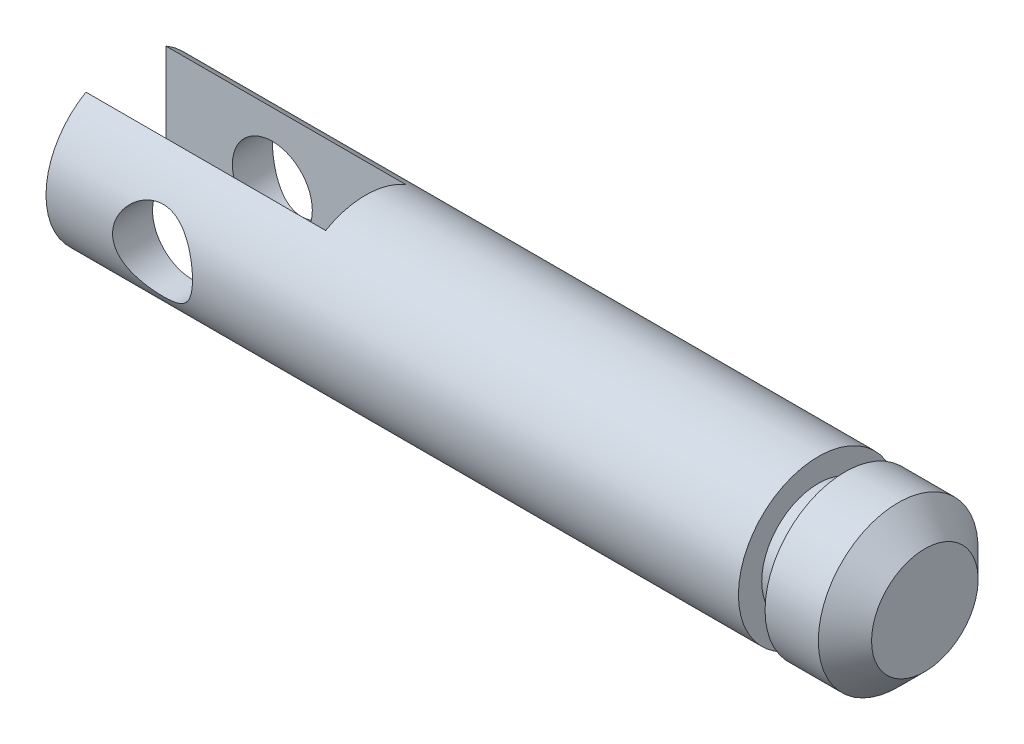
ISO-10303-21;
HEADER;
FILE_DESCRIPTION(('STEP AP214'),'2;1');
FILE_NAME('part.step','',(''),(''),'','','');
FILE_SCHEMA(('AUTOMOTIVE_DESIGN { 1 0 10303 214 1 1 1 1 }'));
ENDSEC;
DATA;
#1=APPLICATION_CONTEXT('core data for automotive mechanical design processes');
#2=APPLICATION_PROTOCOL_DEFINITION('international standard','automotive_design',2000,#1);
#3=PRODUCT_CONTEXT('',#1,'mechanical');
#4=PRODUCT('Part','Part','',(#3));
#5=PRODUCT_RELATED_PRODUCT_CATEGORY('part','',(#4));
#6=PRODUCT_DEFINITION_FORMATION('','',#4);
#7=PRODUCT_DEFINITION_CONTEXT('part definition',#1,'design');
#8=PRODUCT_DEFINITION('design','',#6,#7);
#9=PRODUCT_DEFINITION_SHAPE('','',#8);
#10=(LENGTH_UNIT() NAMED_UNIT(*) SI_UNIT(.MILLI.,.METRE.));
#11=(NAMED_UNIT(*) PLANE_ANGLE_UNIT() SI_UNIT($,.RADIAN.));
#12=(NAMED_UNIT(*) SI_UNIT($,.STERADIAN.) SOLID_ANGLE_UNIT());
#13=UNCERTAINTY_MEASURE_WITH_UNIT(LENGTH_MEASURE(1.E-05),#10,'distance_accuracy_value','');
#14=(GEOMETRIC_REPRESENTATION_CONTEXT(3) GLOBAL_UNCERTAINTY_ASSIGNED_CONTEXT((#13)) GLOBAL_UNIT_ASSIGNED_CONTEXT((#10,
#11,#12)) REPRESENTATION_CONTEXT('',''));
#15=CARTESIAN_POINT('',(0.,0.,0.));
#16=DIRECTION('',(0.,0.,1.));
#17=DIRECTION('',(1.,0.,0.));
#18=AXIS2_PLACEMENT_3D('',#15,#16,#17);
#19=CARTESIAN_POINT('',(0.,3.,0.));
#20=DIRECTION('',(1.,0.,0.));
#21=DIRECTION('',(0.,0.,-1.));
#22=AXIS2_PLACEMENT_3D('',#19,#20,#21);
#23=PLANE('',#22);
#24=CARTESIAN_POINT('',(0.,0.,0.));
#25=DIRECTION('',(-1.,0.,0.));
#26=DIRECTION('',(0.,0.,1.));
#27=AXIS2_PLACEMENT_3D('',#24,#25,#26);
#28=CIRCLE('',#27,3.);
#29=CARTESIAN_POINT('',(0.,2.59807621135331,-1.5));
#30=VERTEX_POINT('',#29);
#31=CARTESIAN_POINT('',(0.,-2.59807621135331,-1.5));
#32=VERTEX_POINT('',#31);
#33=EDGE_CURVE('E104',#30,#32,#28,.T.);
#34=ORIENTED_EDGE('',*,*,#33,.T.);
#35=DIRECTION('',(0.,1.,0.));
#36=VECTOR('',#35,1.);
#37=CARTESIAN_POINT('',(0.,3.,-1.5));
#38=LINE('',#37,#36);
#39=EDGE_CURVE('E125',#32,#30,#38,.T.);
#40=ORIENTED_EDGE('',*,*,#39,.T.);
#41=EDGE_LOOP('',(#34,#40));
#42=FACE_BOUND('',#41,.T.);
#43=ADVANCED_FACE('F37',(#42),#23,.F.);
#44=CARTESIAN_POINT('',(30.,0.,0.));
#45=DIRECTION('',(-1.,0.,0.));
#46=DIRECTION('',(0.,0.,1.));
#47=AXIS2_PLACEMENT_3D('',#44,#45,#46);
#48=PLANE('',#47);
#49=CARTESIAN_POINT('',(30.,0.,0.));
#50=DIRECTION('',(-1.,0.,0.));
#51=DIRECTION('',(0.,0.,1.));
#52=AXIS2_PLACEMENT_3D('',#49,#50,#51);
#53=CIRCLE('',#52,2.);
#54=CARTESIAN_POINT('',(30.,0.,2.));
#55=VERTEX_POINT('',#54);
#56=EDGE_CURVE('E120',#55,#55,#53,.T.);
#57=ORIENTED_EDGE('',*,*,#56,.F.);
#58=EDGE_LOOP('',(#57));
#59=FACE_BOUND('',#58,.T.);
#60=ADVANCED_FACE('F39',(#59),#48,.F.);
#61=CARTESIAN_POINT('',(30.,0.,0.));
#62=DIRECTION('',(-1.,0.,0.));
#63=DIRECTION('',(0.,0.,1.));
#64=AXIS2_PLACEMENT_3D('',#61,#62,#63);
#65=CONICAL_SURFACE('',#64,2.,0.785398163397446);
#66=CARTESIAN_POINT('',(29.,0.,0.));
#67=DIRECTION('',(-1.,0.,0.));
#68=DIRECTION('',(0.,0.,1.));
#69=AXIS2_PLACEMENT_3D('',#66,#67,#68);
#70=CIRCLE('',#69,3.);
#71=CARTESIAN_POINT('',(29.,0.,3.));
#72=VERTEX_POINT('',#71);
#73=EDGE_CURVE('E117',#72,#72,#70,.T.);
#74=ORIENTED_EDGE('',*,*,#73,.F.);
#75=EDGE_LOOP('',(#74));
#76=FACE_BOUND('',#75,.T.);
#77=ORIENTED_EDGE('',*,*,#56,.T.);
#78=EDGE_LOOP('',(#77));
#79=FACE_BOUND('',#78,.T.);
#80=ADVANCED_FACE('F137',(#76,#79),#65,.T.);
#81=CARTESIAN_POINT('',(0.,0.,0.));
#82=DIRECTION('',(-1.,0.,0.));
#83=DIRECTION('',(0.,0.,1.));
#84=AXIS2_PLACEMENT_3D('',#81,#82,#83);
#85=CYLINDRICAL_SURFACE('',#84,3.);
#86=CARTESIAN_POINT('',(27.,0.,0.));
#87=DIRECTION('',(-1.,0.,0.));
#88=DIRECTION('',(0.,0.,1.));
#89=AXIS2_PLACEMENT_3D('',#86,#87,#88);
#90=CIRCLE('',#89,3.);
#91=CARTESIAN_POINT('',(27.,0.,3.));
#92=VERTEX_POINT('',#91);
#93=EDGE_CURVE('E114',#92,#92,#90,.T.);
#94=ORIENTED_EDGE('',*,*,#93,.F.);
#95=EDGE_LOOP('',(#94));
#96=FACE_BOUND('',#95,.T.);
#97=ORIENTED_EDGE('',*,*,#73,.T.);
#98=EDGE_LOOP('',(#97));
#99=FACE_BOUND('',#98,.T.);
#100=ADVANCED_FACE('F274',(#96,#99),#85,.T.);
#101=CARTESIAN_POINT('',(27.,3.,0.));
#102=DIRECTION('',(1.,0.,0.));
#103=DIRECTION('',(0.,0.,-1.));
#104=AXIS2_PLACEMENT_3D('',#101,#102,#103);
#105=PLANE('',#104);
#106=CARTESIAN_POINT('',(27.,0.,0.));
#107=DIRECTION('',(-1.,0.,0.));
#108=DIRECTION('',(0.,0.,1.));
#109=AXIS2_PLACEMENT_3D('',#106,#107,#108);
#110=CIRCLE('',#109,2.125);
#111=CARTESIAN_POINT('',(27.,0.,2.125));
#112=VERTEX_POINT('',#111);
#113=EDGE_CURVE('E111',#112,#112,#110,.T.);
#114=ORIENTED_EDGE('',*,*,#113,.F.);
#115=EDGE_LOOP('',(#114));
#116=FACE_BOUND('',#115,.T.);
#117=ORIENTED_EDGE('',*,*,#93,.T.);
#118=EDGE_LOOP('',(#117));
#119=FACE_BOUND('',#118,.T.);
#120=ADVANCED_FACE('F264',(#116,#119),#105,.F.);
#121=CARTESIAN_POINT('',(0.,0.,0.));
#122=DIRECTION('',(-1.,0.,0.));
#123=DIRECTION('',(0.,0.,1.));
#124=AXIS2_PLACEMENT_3D('',#121,#122,#123);
#125=CYLINDRICAL_SURFACE('',#124,2.125);
#126=CARTESIAN_POINT('',(26.,0.,0.));
#127=DIRECTION('',(-1.,0.,0.));
#128=DIRECTION('',(0.,0.,1.));
#129=AXIS2_PLACEMENT_3D('',#126,#127,#128);
#130=CIRCLE('',#129,2.125);
#131=CARTESIAN_POINT('',(26.,0.,2.125));
#132=VERTEX_POINT('',#131);
#133=EDGE_CURVE('E108',#132,#132,#130,.T.);
#134=ORIENTED_EDGE('',*,*,#133,.F.);
#135=EDGE_LOOP('',(#134));
#136=FACE_BOUND('',#135,.T.);
#137=ORIENTED_EDGE('',*,*,#113,.T.);
#138=EDGE_LOOP('',(#137));
#139=FACE_BOUND('',#138,.T.);
#140=ADVANCED_FACE('F153',(#136,#139),#125,.T.);
#141=CARTESIAN_POINT('',(26.,2.125,0.));
#142=DIRECTION('',(-1.,0.,0.));
#143=DIRECTION('',(0.,0.,1.));
#144=AXIS2_PLACEMENT_3D('',#141,#142,#143);
#145=PLANE('',#144);
#146=CARTESIAN_POINT('',(26.,0.,0.));
#147=DIRECTION('',(-1.,0.,0.));
#148=DIRECTION('',(0.,0.,1.));
#149=AXIS2_PLACEMENT_3D('',#146,#147,#148);
#150=CIRCLE('',#149,3.);
#151=CARTESIAN_POINT('',(26.,0.,3.));
#152=VERTEX_POINT('',#151);
#153=EDGE_CURVE('E105',#152,#152,#150,.T.);
#154=ORIENTED_EDGE('',*,*,#153,.F.);
#155=EDGE_LOOP('',(#154));
#156=FACE_BOUND('',#155,.T.);
#157=ORIENTED_EDGE('',*,*,#133,.T.);
#158=EDGE_LOOP('',(#157));
#159=FACE_BOUND('',#158,.T.);
#160=ADVANCED_FACE('F148',(#156,#159),#145,.F.);
#161=CARTESIAN_POINT('',(0.,0.,0.));
#162=DIRECTION('',(-1.,0.,0.));
#163=DIRECTION('',(0.,0.,1.));
#164=AXIS2_PLACEMENT_3D('',#161,#162,#163);
#165=CYLINDRICAL_SURFACE('',#164,3.);
#166=CARTESIAN_POINT('',(5.5,0.,-3.));
#167=CARTESIAN_POINT('',(5.49999504652421,0.0788579444268501,-2.99999570107562));
#168=CARTESIAN_POINT('',(5.49374489031842,0.157809899546344,-2.99685736529634));
#169=CARTESIAN_POINT('',(5.46902067948769,0.313380352903344,-2.98461234055735));
#170=CARTESIAN_POINT('',(5.45052341050328,0.389994130070444,-2.97549431743379));
#171=CARTESIAN_POINT('',(5.40220928707506,0.538400317320673,-2.95224419105063));
#172=CARTESIAN_POINT('',(5.37243642362805,0.610210204408719,-2.93813158766306));
#173=CARTESIAN_POINT('',(5.30264406795252,0.747708925209897,-2.90618664773642));
#174=CARTESIAN_POINT('',(5.2626253836267,0.813398240985088,-2.88835460450288));
#175=CARTESIAN_POINT('',(5.17072412577207,0.941261726642863,-2.84934387387093));
#176=CARTESIAN_POINT('',(5.11827028114054,1.00298281668316,-2.82802798691306));
#177=CARTESIAN_POINT('',(5.00421778112945,1.11716916730047,-2.78489955370114));
#178=CARTESIAN_POINT('',(4.94261222234134,1.16962737466015,-2.76308664313552));
#179=CARTESIAN_POINT('',(4.80627497571493,1.26787800067542,-2.71948426796021));
#180=CARTESIAN_POINT('',(4.73089585248113,1.31283800332745,-2.69782780455198));
#181=CARTESIAN_POINT('',(4.57244899602068,1.38925234033604,-2.65928968158481));
#182=CARTESIAN_POINT('',(4.48938680691588,1.4207163224495,-2.64240461410484));
#183=CARTESIAN_POINT('',(4.32300234186712,1.46719866328288,-2.61686800556713));
#184=CARTESIAN_POINT('',(4.23999332189891,1.48308878562066,-2.6077840737557));
#185=CARTESIAN_POINT('',(4.07203174333078,1.50064048996327,-2.59772834922792));
#186=CARTESIAN_POINT('',(3.98708118869327,1.50231613255961,-2.59674854014932));
#187=CARTESIAN_POINT('',(3.82857096352695,1.49203093075844,-2.60266395385873));
#188=CARTESIAN_POINT('',(3.75486395316542,1.48167683930523,-2.6086314549302));
#189=CARTESIAN_POINT('',(3.61041713594044,1.4504097735854,-2.62614343100775));
#190=CARTESIAN_POINT('',(3.53967828204203,1.42949343584648,-2.63768968247664));
#191=CARTESIAN_POINT('',(3.40115630115151,1.377314670579,-2.66531214619111));
#192=CARTESIAN_POINT('',(3.33348040182132,1.34582260067399,-2.68148760995998));
#193=CARTESIAN_POINT('',(3.20404856111499,1.273562531502,-2.71655106422105));
#194=CARTESIAN_POINT('',(3.14229529659987,1.2327903657187,-2.73544027170286));
#195=CARTESIAN_POINT('',(3.01821812088516,1.13709908236918,-2.77669736854929));
#196=CARTESIAN_POINT('',(2.95681468963576,1.08104168755392,-2.79920265355119));
#197=CARTESIAN_POINT('',(2.84389687211365,0.959333368112059,-2.84321434950611));
#198=CARTESIAN_POINT('',(2.79238721194918,0.893677884861427,-2.86472027938201));
#199=CARTESIAN_POINT('',(2.69847150845541,0.750774758747772,-2.90552980924446));
#200=CARTESIAN_POINT('',(2.65659929133139,0.673130387399113,-2.92468476243011));
#201=CARTESIAN_POINT('',(2.58685445643549,0.510699323233195,-2.95736821681863));
#202=CARTESIAN_POINT('',(2.55897072247725,0.425918364397913,-2.9709011841533));
#203=CARTESIAN_POINT('',(2.52028689442499,0.259149737491053,-2.98986500612153));
#204=CARTESIAN_POINT('',(2.50826314637983,0.177512295822489,-2.99587407451965));
#205=CARTESIAN_POINT('',(2.49780290329827,0.0131693999240275,-3.00109520188655));
#206=CARTESIAN_POINT('',(2.4993599715408,-0.0695355298048631,-3.00031048081978));
#207=CARTESIAN_POINT('',(2.51531003262812,-0.22684945797898,-2.99236788380152));
#208=CARTESIAN_POINT('',(2.52869879909499,-0.301589112074895,-2.98570868532252));
#209=CARTESIAN_POINT('',(2.56635710784268,-0.447610338452911,-2.9673325697226));
#210=CARTESIAN_POINT('',(2.59062784968024,-0.51889152853663,-2.95561509501618));
#211=CARTESIAN_POINT('',(2.64999769964955,-0.658332912674359,-2.92776377120382));
#212=CARTESIAN_POINT('',(2.68538657517443,-0.726345595508705,-2.91151322654446));
#213=CARTESIAN_POINT('',(2.76566130346985,-0.855692042548907,-2.87615961476126));
#214=CARTESIAN_POINT('',(2.81055120189309,-0.917022944664887,-2.85705533350407));
#215=CARTESIAN_POINT('',(2.91364063799608,-1.03765153393382,-2.81562332004297));
#216=CARTESIAN_POINT('',(2.97271430266772,-1.09615811672854,-2.79316327265249));
#217=CARTESIAN_POINT('',(3.09988772691659,-1.20278448167828,-2.7489358741323));
#218=CARTESIAN_POINT('',(3.16799367827188,-1.25089707856781,-2.7271690110007));
#219=CARTESIAN_POINT('',(3.31546548125946,-1.33756187171853,-2.68576788309734));
#220=CARTESIAN_POINT('',(3.39521689914172,-1.37553824370037,-2.66628794383591));
#221=CARTESIAN_POINT('',(3.56126510136245,-1.43712423890206,-2.63361108441202));
#222=CARTESIAN_POINT('',(3.64755328970034,-1.46075237380052,-2.62040607332625));
#223=CARTESIAN_POINT('',(3.81536533432706,-1.49079253120031,-2.60342251538703));
#224=CARTESIAN_POINT('',(3.89655138015286,-1.49863949460818,-2.59886075197597));
#225=CARTESIAN_POINT('',(4.05917060074679,-1.5010337315643,-2.59748031962405));
#226=CARTESIAN_POINT('',(4.14060365310679,-1.49558676993486,-2.60065829439585));
#227=CARTESIAN_POINT('',(4.29322525230016,-1.47288918838996,-2.61356793076615));
#228=CARTESIAN_POINT('',(4.36465070521711,-1.45681247151455,-2.62264641723988));
#229=CARTESIAN_POINT('',(4.50371217913655,-1.41476303733662,-2.64556524281479));
#230=CARTESIAN_POINT('',(4.57134697313805,-1.38878713673988,-2.65940711354503));
#231=CARTESIAN_POINT('',(4.70593727647981,-1.32572361795085,-2.69142795546803));
#232=CARTESIAN_POINT('',(4.77254185274354,-1.28800670672355,-2.70983583593881));
#233=CARTESIAN_POINT('',(4.89891180427189,-1.20322645745609,-2.7485299745229));
#234=CARTESIAN_POINT('',(4.95867359578167,-1.15615825686234,-2.76881720693416));
#235=CARTESIAN_POINT('',(5.07721297353201,-1.04730498999206,-2.81193484737138));
#236=CARTESIAN_POINT('',(5.13498865352544,-0.984426634495891,-2.83477474959942));
#237=CARTESIAN_POINT('',(5.2393944751529,-0.849232209349795,-2.87816628389896));
#238=CARTESIAN_POINT('',(5.28601860920486,-0.776911084957796,-2.89871667939293));
#239=CARTESIAN_POINT('',(5.3668545440681,-0.623897395174419,-2.93547014349806));
#240=CARTESIAN_POINT('',(5.4009762538547,-0.543149255665096,-2.95164144740899));
#241=CARTESIAN_POINT('',(5.45471225163611,-0.37611315170713,-2.9775201194848));
#242=CARTESIAN_POINT('',(5.47436777020857,-0.28984169938365,-2.98724585044602));
#243=CARTESIAN_POINT('',(5.49084611662861,-0.168902919736343,-2.99543192870217));
#244=CARTESIAN_POINT('',(5.49427396129951,-0.135242819162347,-2.99714048010376));
#245=CARTESIAN_POINT('',(5.49885199827113,-0.0677275977076368,-2.99942545465223));
#246=CARTESIAN_POINT('',(5.50000212770531,-0.0338724714699424,-3.00000184655071));
#247=CARTESIAN_POINT('',(5.5,0.,-3.));
#248=B_SPLINE_CURVE_WITH_KNOTS('',3,(#166,#167,#168,#169,#170,#171,#172,#173,#174,#175,#176,
#177,#178,#179,#180,#181,#182,#183,#184,#185,#186,#187,#188,#189,#190,#191,#192,#193,#194,#195,
#196,#197,#198,#199,#200,#201,#202,#203,#204,#205,#206,#207,#208,#209,#210,#211,#212,#213,#214,
#215,#216,#217,#218,#219,#220,#221,#222,#223,#224,#225,#226,#227,#228,#229,#230,#231,#232,#233,
#234,#235,#236,#237,#238,#239,#240,#241,#242,#243,#244,#245,#246,#247),.UNSPECIFIED.,.T.,.F.,(4,
2,2,2,2,2,2,2,2,2,2,2,2,2,2,2,2,2,2,2,2,2,2,2,2,2,2,2,2,2,2,2,2,2,2,2,2,2,2,2,4),(0.,
0.236436386130439,0.473322224563796,0.709293233238447,0.945245640872351,1.19547263807713,
1.44588935648105,1.71572589646129,1.98536921847421,2.23887018210344,2.49212035993531,
2.71508568613981,2.93812205888518,3.16635360252731,3.39468781890333,3.65197412000818,
3.90938301898029,4.17874533321661,4.44789325368419,4.69474935707018,4.94148846767214,
5.16910359759183,5.39674382446397,5.63089284041848,5.86514176122509,6.12239415966628,
6.37982382923147,6.64972023242588,6.91926767918176,7.1629396125457,7.40650589797017,
7.62686895373283,7.84730293182526,8.08254685170431,8.31791341715446,8.58187864135757,
8.84598575071868,9.1119602049529,9.37717362931724,9.47872920200875,9.58028757766599),.UNSPECIFIED.);
#249=CARTESIAN_POINT('',(5.5,0.,-3.));
#250=VERTEX_POINT('',#249);
#251=EDGE_CURVE('E86',#250,#250,#248,.T.);
#252=ORIENTED_EDGE('',*,*,#251,.T.);
#253=EDGE_LOOP('',(#252));
#254=FACE_BOUND('',#253,.T.);
#255=CARTESIAN_POINT('',(5.5,0.,3.));
#256=CARTESIAN_POINT('',(5.49999504652421,-0.0788579444268501,2.99999570107562));
#257=CARTESIAN_POINT('',(5.49374489031842,-0.157809899546344,2.99685736529635));
#258=CARTESIAN_POINT('',(5.46902067948769,-0.313380352903344,2.98461234055735));
#259=CARTESIAN_POINT('',(5.45052341050328,-0.389994130070444,2.97549431743379));
#260=CARTESIAN_POINT('',(5.40220928707506,-0.538400317320673,2.95224419105063));
#261=CARTESIAN_POINT('',(5.37243642362805,-0.610210204408719,2.93813158766306));
#262=CARTESIAN_POINT('',(5.30264406795252,-0.747708925209898,2.90618664773642));
#263=CARTESIAN_POINT('',(5.2626253836267,-0.813398240985088,2.88835460450288));
#264=CARTESIAN_POINT('',(5.17072412577207,-0.941261726642864,2.84934387387093));
#265=CARTESIAN_POINT('',(5.11827028114054,-1.00298281668316,2.82802798691306));
#266=CARTESIAN_POINT('',(5.00421778112945,-1.11716916730047,2.78489955370114));
#267=CARTESIAN_POINT('',(4.94261222234134,-1.16962737466015,2.76308664313552));
#268=CARTESIAN_POINT('',(4.80627497571493,-1.26787800067542,2.71948426796021));
#269=CARTESIAN_POINT('',(4.73089585248113,-1.31283800332745,2.69782780455198));
#270=CARTESIAN_POINT('',(4.57244899602068,-1.38925234033604,2.65928968158481));
#271=CARTESIAN_POINT('',(4.48938680691588,-1.4207163224495,2.64240461410484));
#272=CARTESIAN_POINT('',(4.32300234186712,-1.46719866328288,2.61686800556713));
#273=CARTESIAN_POINT('',(4.23999332189891,-1.48308878562066,2.6077840737557));
#274=CARTESIAN_POINT('',(4.07203174333078,-1.50064048996327,2.59772834922791));
#275=CARTESIAN_POINT('',(3.98708118869327,-1.50231613255961,2.59674854014932));
#276=CARTESIAN_POINT('',(3.82857096352695,-1.49203093075844,2.60266395385873));
#277=CARTESIAN_POINT('',(3.75486395316542,-1.48167683930523,2.6086314549302));
#278=CARTESIAN_POINT('',(3.61041713594044,-1.4504097735854,2.62614343100775));
#279=CARTESIAN_POINT('',(3.53967828204203,-1.42949343584648,2.63768968247664));
#280=CARTESIAN_POINT('',(3.40115630115151,-1.37731467057901,2.66531214619111));
#281=CARTESIAN_POINT('',(3.33348040182132,-1.34582260067399,2.68148760995998));
#282=CARTESIAN_POINT('',(3.20404856111499,-1.273562531502,2.71655106422105));
#283=CARTESIAN_POINT('',(3.14229529659987,-1.2327903657187,2.73544027170286));
#284=CARTESIAN_POINT('',(3.01821812088516,-1.13709908236918,2.77669736854929));
#285=CARTESIAN_POINT('',(2.95681468963576,-1.08104168755392,2.79920265355119));
#286=CARTESIAN_POINT('',(2.84389687211365,-0.95933336811206,2.84321434950611));
#287=CARTESIAN_POINT('',(2.79238721194918,-0.893677884861428,2.86472027938201));
#288=CARTESIAN_POINT('',(2.69847150845541,-0.750774758747773,2.90552980924446));
#289=CARTESIAN_POINT('',(2.65659929133139,-0.673130387399114,2.92468476243011));
#290=CARTESIAN_POINT('',(2.58685445643549,-0.510699323233195,2.95736821681863));
#291=CARTESIAN_POINT('',(2.55897072247725,-0.425918364397914,2.9709011841533));
#292=CARTESIAN_POINT('',(2.52028689442499,-0.259149737491054,2.98986500612153));
#293=CARTESIAN_POINT('',(2.50826314637983,-0.17751229582249,2.99587407451965));
#294=CARTESIAN_POINT('',(2.49780290329827,-0.0131693999240277,3.00109520188655));
#295=CARTESIAN_POINT('',(2.4993599715408,0.0695355298048628,3.00031048081978));
#296=CARTESIAN_POINT('',(2.51531003262812,0.22684945797898,2.99236788380152));
#297=CARTESIAN_POINT('',(2.52869879909499,0.301589112074894,2.98570868532252));
#298=CARTESIAN_POINT('',(2.56635710784268,0.447610338452911,2.9673325697226));
#299=CARTESIAN_POINT('',(2.59062784968024,0.51889152853663,2.95561509501618));
#300=CARTESIAN_POINT('',(2.64999769964955,0.658332912674359,2.92776377120382));
#301=CARTESIAN_POINT('',(2.68538657517443,0.726345595508705,2.91151322654446));
#302=CARTESIAN_POINT('',(2.76566130346985,0.855692042548907,2.87615961476126));
#303=CARTESIAN_POINT('',(2.81055120189309,0.917022944664887,2.85705533350407));
#304=CARTESIAN_POINT('',(2.91364063799608,1.03765153393382,2.81562332004297));
#305=CARTESIAN_POINT('',(2.97271430266772,1.09615811672854,2.79316327265249));
#306=CARTESIAN_POINT('',(3.09988772691659,1.20278448167828,2.7489358741323));
#307=CARTESIAN_POINT('',(3.16799367827188,1.25089707856781,2.7271690110007));
#308=CARTESIAN_POINT('',(3.31546548125946,1.33756187171853,2.68576788309734));
#309=CARTESIAN_POINT('',(3.39521689914172,1.37553824370037,2.66628794383591));
#310=CARTESIAN_POINT('',(3.56126510136245,1.43712423890206,2.63361108441202));
#311=CARTESIAN_POINT('',(3.64755328970034,1.46075237380052,2.62040607332625));
#312=CARTESIAN_POINT('',(3.81536533432706,1.49079253120031,2.60342251538703));
#313=CARTESIAN_POINT('',(3.89655138015286,1.49863949460818,2.59886075197597));
#314=CARTESIAN_POINT('',(4.05917060074679,1.5010337315643,2.59748031962405));
#315=CARTESIAN_POINT('',(4.14060365310679,1.49558676993486,2.60065829439585));
#316=CARTESIAN_POINT('',(4.29322525230016,1.47288918838996,2.61356793076615));
#317=CARTESIAN_POINT('',(4.36465070521711,1.45681247151455,2.62264641723988));
#318=CARTESIAN_POINT('',(4.50371217913655,1.41476303733662,2.64556524281479));
#319=CARTESIAN_POINT('',(4.57134697313805,1.38878713673988,2.65940711354503));
#320=CARTESIAN_POINT('',(4.70593727647981,1.32572361795085,2.69142795546803));
#321=CARTESIAN_POINT('',(4.77254185274354,1.28800670672355,2.70983583593881));
#322=CARTESIAN_POINT('',(4.89891180427189,1.20322645745609,2.7485299745229));
#323=CARTESIAN_POINT('',(4.95867359578167,1.15615825686234,2.76881720693416));
#324=CARTESIAN_POINT('',(5.07721297353201,1.04730498999206,2.81193484737138));
#325=CARTESIAN_POINT('',(5.13498865352544,0.984426634495891,2.83477474959942));
#326=CARTESIAN_POINT('',(5.2393944751529,0.849232209349795,2.87816628389896));
#327=CARTESIAN_POINT('',(5.28601860920486,0.776911084957796,2.89871667939293));
#328=CARTESIAN_POINT('',(5.3668545440681,0.623897395174419,2.93547014349806));
#329=CARTESIAN_POINT('',(5.4009762538547,0.543149255665096,2.95164144740899));
#330=CARTESIAN_POINT('',(5.45471225163611,0.37611315170713,2.9775201194848));
#331=CARTESIAN_POINT('',(5.47436777020857,0.28984169938365,2.98724585044602));
#332=CARTESIAN_POINT('',(5.49084611662861,0.168902919736343,2.99543192870217));
#333=CARTESIAN_POINT('',(5.49427396129951,0.135242819162348,2.99714048010376));
#334=CARTESIAN_POINT('',(5.49885199827113,0.067727597707638,2.99942545465223));
#335=CARTESIAN_POINT('',(5.50000212770531,0.033872471469943,3.00000184655071));
#336=CARTESIAN_POINT('',(5.5,0.,3.));
#337=B_SPLINE_CURVE_WITH_KNOTS('',3,(#255,#256,#257,#258,#259,#260,#261,#262,#263,#264,#265,
#266,#267,#268,#269,#270,#271,#272,#273,#274,#275,#276,#277,#278,#279,#280,#281,#282,#283,#284,
#285,#286,#287,#288,#289,#290,#291,#292,#293,#294,#295,#296,#297,#298,#299,#300,#301,#302,#303,
#304,#305,#306,#307,#308,#309,#310,#311,#312,#313,#314,#315,#316,#317,#318,#319,#320,#321,#322,
#323,#324,#325,#326,#327,#328,#329,#330,#331,#332,#333,#334,#335,#336),.UNSPECIFIED.,.T.,.F.,(4,
2,2,2,2,2,2,2,2,2,2,2,2,2,2,2,2,2,2,2,2,2,2,2,2,2,2,2,2,2,2,2,2,2,2,2,2,2,2,2,4),(0.,
0.236436386130439,0.473322224563796,0.709293233238448,0.945245640872351,1.19547263807713,
1.44588935648105,1.71572589646129,1.98536921847421,2.23887018210344,2.49212035993531,
2.71508568613981,2.93812205888518,3.16635360252731,3.39468781890332,3.65197412000818,
3.90938301898029,4.17874533321661,4.44789325368419,4.69474935707018,4.94148846767214,
5.16910359759183,5.39674382446397,5.63089284041848,5.86514176122509,6.12239415966628,
6.37982382923147,6.64972023242588,6.91926767918176,7.1629396125457,7.40650589797017,
7.62686895373283,7.84730293182526,8.0825468517043,8.31791341715446,8.58187864135757,
8.84598575071868,9.1119602049529,9.37717362931724,9.47872920200875,9.58028757766599),.UNSPECIFIED.);
#338=CARTESIAN_POINT('',(5.5,0.,3.));
#339=VERTEX_POINT('',#338);
#340=EDGE_CURVE('E162',#339,#339,#337,.T.);
#341=ORIENTED_EDGE('',*,*,#340,.T.);
#342=EDGE_LOOP('',(#341));
#343=FACE_BOUND('',#342,.T.);
#344=ORIENTED_EDGE('',*,*,#33,.F.);
#345=DIRECTION('',(-1.,0.,0.));
#346=VECTOR('',#345,1.);
#347=CARTESIAN_POINT('',(0.,2.59807621135332,-1.5));
#348=LINE('',#347,#346);
#349=CARTESIAN_POINT('',(9.,2.59807621135332,-1.5));
#350=VERTEX_POINT('',#349);
#351=EDGE_CURVE('E95',#30,#350,#348,.F.);
#352=ORIENTED_EDGE('',*,*,#351,.T.);
#353=CARTESIAN_POINT('',(9.,0.,0.));
#354=DIRECTION('',(1.,0.,0.));
#355=DIRECTION('',(0.,0.,-1.));
#356=AXIS2_PLACEMENT_3D('',#353,#354,#355);
#357=CIRCLE('',#356,3.);
#358=CARTESIAN_POINT('',(9.,2.59807621135332,1.5));
#359=VERTEX_POINT('',#358);
#360=EDGE_CURVE('E46',#350,#359,#357,.T.);
#361=ORIENTED_EDGE('',*,*,#360,.T.);
#362=DIRECTION('',(-1.,0.,0.));
#363=VECTOR('',#362,1.);
#364=CARTESIAN_POINT('',(0.,2.59807621135332,1.5));
#365=LINE('',#364,#363);
#366=CARTESIAN_POINT('',(0.,2.59807621135331,1.5));
#367=VERTEX_POINT('',#366);
#368=EDGE_CURVE('E85',#359,#367,#365,.T.);
#369=ORIENTED_EDGE('',*,*,#368,.T.);
#370=CARTESIAN_POINT('',(0.,-2.59807621135331,1.5));
#371=VERTEX_POINT('',#370);
#372=EDGE_CURVE('E93',#371,#367,#28,.T.);
#373=ORIENTED_EDGE('',*,*,#372,.F.);
#374=DIRECTION('',(-1.,0.,0.));
#375=VECTOR('',#374,1.);
#376=CARTESIAN_POINT('',(0.,-2.59807621135332,1.5));
#377=LINE('',#376,#375);
#378=CARTESIAN_POINT('',(9.,-2.59807621135332,1.5));
#379=VERTEX_POINT('',#378);
#380=EDGE_CURVE('E53',#371,#379,#377,.F.);
#381=ORIENTED_EDGE('',*,*,#380,.T.);
#382=CARTESIAN_POINT('',(9.,-2.59807621135332,-1.5));
#383=VERTEX_POINT('',#382);
#384=EDGE_CURVE('E11',#379,#383,#357,.T.);
#385=ORIENTED_EDGE('',*,*,#384,.T.);
#386=DIRECTION('',(-1.,0.,0.));
#387=VECTOR('',#386,1.);
#388=CARTESIAN_POINT('',(0.,-2.59807621135332,-1.5));
#389=LINE('',#388,#387);
#390=EDGE_CURVE('E101',#383,#32,#389,.T.);
#391=ORIENTED_EDGE('',*,*,#390,.T.);
#392=EDGE_LOOP('',(#344,#352,#361,#369,#373,#381,#385,#391));
#393=FACE_BOUND('',#392,.T.);
#394=ORIENTED_EDGE('',*,*,#153,.T.);
#395=EDGE_LOOP('',(#394));
#396=FACE_BOUND('',#395,.T.);
#397=ADVANCED_FACE('F90',(#254,#343,#393,#396),#165,.T.);
#398=ORIENTED_EDGE('',*,*,#372,.T.);
#399=DIRECTION('',(0.,-1.,0.));
#400=VECTOR('',#399,1.);
#401=CARTESIAN_POINT('',(0.,3.,1.5));
#402=LINE('',#401,#400);
#403=EDGE_CURVE('E123',#367,#371,#402,.T.);
#404=ORIENTED_EDGE('',*,*,#403,.T.);
#405=EDGE_LOOP('',(#398,#404));
#406=FACE_BOUND('',#405,.T.);
#407=ADVANCED_FACE('F133',(#406),#23,.F.);
#408=CARTESIAN_POINT('',(9.,-3.,-1.5));
#409=DIRECTION('',(1.,0.,0.));
#410=DIRECTION('',(0.,0.,-1.));
#411=AXIS2_PLACEMENT_3D('',#408,#409,#410);
#412=PLANE('',#411);
#413=DIRECTION('',(0.,1.,0.));
#414=VECTOR('',#413,1.);
#415=CARTESIAN_POINT('',(9.,-3.,-1.5));
#416=LINE('',#415,#414);
#417=EDGE_CURVE('E80',#383,#350,#416,.T.);
#418=ORIENTED_EDGE('',*,*,#417,.F.);
#419=ORIENTED_EDGE('',*,*,#384,.F.);
#420=DIRECTION('',(0.,1.,0.));
#421=VECTOR('',#420,1.);
#422=CARTESIAN_POINT('',(9.,-3.,1.5));
#423=LINE('',#422,#421);
#424=EDGE_CURVE('E79',#379,#359,#423,.T.);
#425=ORIENTED_EDGE('',*,*,#424,.T.);
#426=ORIENTED_EDGE('',*,*,#360,.F.);
#427=EDGE_LOOP('',(#418,#419,#425,#426));
#428=FACE_BOUND('',#427,.T.);
#429=ADVANCED_FACE('F78',(#428),#412,.F.);
#430=CARTESIAN_POINT('',(0.,-3.,-1.5));
#431=DIRECTION('',(0.,0.,-1.));
#432=DIRECTION('',(-1.,0.,0.));
#433=AXIS2_PLACEMENT_3D('',#430,#431,#432);
#434=PLANE('',#433);
#435=CARTESIAN_POINT('',(4.,0.,-1.5));
#436=DIRECTION('',(0.,0.,-1.));
#437=DIRECTION('',(-1.,0.,0.));
#438=AXIS2_PLACEMENT_3D('',#435,#436,#437);
#439=CIRCLE('',#438,1.5);
#440=CARTESIAN_POINT('',(2.5,0.,-1.5));
#441=VERTEX_POINT('',#440);
#442=EDGE_CURVE('E189',#441,#441,#439,.T.);
#443=ORIENTED_EDGE('',*,*,#442,.T.);
#444=EDGE_LOOP('',(#443));
#445=FACE_BOUND('',#444,.T.);
#446=ORIENTED_EDGE('',*,*,#417,.T.);
#447=ORIENTED_EDGE('',*,*,#351,.F.);
#448=ORIENTED_EDGE('',*,*,#39,.F.);
#449=ORIENTED_EDGE('',*,*,#390,.F.);
#450=EDGE_LOOP('',(#446,#447,#448,#449));
#451=FACE_BOUND('',#450,.T.);
#452=ADVANCED_FACE('F129',(#445,#451),#434,.F.);
#453=CARTESIAN_POINT('',(0.,-3.,1.5));
#454=DIRECTION('',(0.,0.,1.));
#455=DIRECTION('',(1.,0.,0.));
#456=AXIS2_PLACEMENT_3D('',#453,#454,#455);
#457=PLANE('',#456);
#458=CARTESIAN_POINT('',(4.,0.,1.5));
#459=DIRECTION('',(0.,0.,1.));
#460=DIRECTION('',(1.,0.,0.));
#461=AXIS2_PLACEMENT_3D('',#458,#459,#460);
#462=CIRCLE('',#461,1.5);
#463=CARTESIAN_POINT('',(5.5,0.,1.5));
#464=VERTEX_POINT('',#463);
#465=EDGE_CURVE('E41',#464,#464,#462,.T.);
#466=ORIENTED_EDGE('',*,*,#465,.T.);
#467=EDGE_LOOP('',(#466));
#468=FACE_BOUND('',#467,.T.);
#469=ORIENTED_EDGE('',*,*,#424,.F.);
#470=ORIENTED_EDGE('',*,*,#380,.F.);
#471=ORIENTED_EDGE('',*,*,#403,.F.);
#472=ORIENTED_EDGE('',*,*,#368,.F.);
#473=EDGE_LOOP('',(#469,#470,#471,#472));
#474=FACE_BOUND('',#473,.T.);
#475=ADVANCED_FACE('F83',(#468,#474),#457,.F.);
#476=CARTESIAN_POINT('',(4.,0.,-3.));
#477=DIRECTION('',(0.,0.,1.));
#478=DIRECTION('',(1.,0.,0.));
#479=AXIS2_PLACEMENT_3D('',#476,#477,#478);
#480=CYLINDRICAL_SURFACE('',#479,1.5);
#481=ORIENTED_EDGE('',*,*,#465,.F.);
#482=EDGE_LOOP('',(#481));
#483=FACE_BOUND('',#482,.T.);
#484=ORIENTED_EDGE('',*,*,#340,.F.);
#485=EDGE_LOOP('',(#484));
#486=FACE_BOUND('',#485,.T.);
#487=ADVANCED_FACE('F176',(#483,#486),#480,.F.);
#488=ORIENTED_EDGE('',*,*,#442,.F.);
#489=EDGE_LOOP('',(#488));
#490=FACE_BOUND('',#489,.T.);
#491=ORIENTED_EDGE('',*,*,#251,.F.);
#492=EDGE_LOOP('',(#491));
#493=FACE_BOUND('',#492,.T.);
#494=ADVANCED_FACE('F172',(#490,#493),#480,.F.);
#495=CLOSED_SHELL('',(#43,#60,#80,#100,#120,#140,#160,#397,#407,#429,#452,#475,#487,#494));
#496=MANIFOLD_SOLID_BREP('B2',#495);
#497=ADVANCED_BREP_SHAPE_REPRESENTATION('',(#18,#496),#14);
#498=SHAPE_DEFINITION_REPRESENTATION(#9,#497);
ENDSEC;
END-ISO-10303-21;
